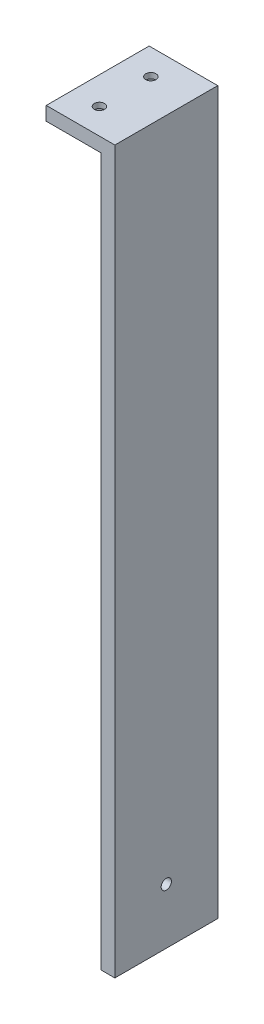
ISO-10303-21;
HEADER;
FILE_DESCRIPTION(('STEP AP214'),'2;1');
FILE_NAME('part.step','',(''),(''),'','','');
FILE_SCHEMA(('AUTOMOTIVE_DESIGN { 1 0 10303 214 1 1 1 1 }'));
ENDSEC;
DATA;
#1=APPLICATION_CONTEXT('core data for automotive mechanical design processes');
#2=APPLICATION_PROTOCOL_DEFINITION('international standard','automotive_design',2000,#1);
#3=PRODUCT_CONTEXT('',#1,'mechanical');
#4=PRODUCT('Part','Part','',(#3));
#5=PRODUCT_RELATED_PRODUCT_CATEGORY('part','',(#4));
#6=PRODUCT_DEFINITION_FORMATION('','',#4);
#7=PRODUCT_DEFINITION_CONTEXT('part definition',#1,'design');
#8=PRODUCT_DEFINITION('design','',#6,#7);
#9=PRODUCT_DEFINITION_SHAPE('','',#8);
#10=(LENGTH_UNIT() NAMED_UNIT(*) SI_UNIT(.MILLI.,.METRE.));
#11=(NAMED_UNIT(*) PLANE_ANGLE_UNIT() SI_UNIT($,.RADIAN.));
#12=(NAMED_UNIT(*) SI_UNIT($,.STERADIAN.) SOLID_ANGLE_UNIT());
#13=UNCERTAINTY_MEASURE_WITH_UNIT(LENGTH_MEASURE(1.E-05),#10,'distance_accuracy_value','');
#14=(GEOMETRIC_REPRESENTATION_CONTEXT(3) GLOBAL_UNCERTAINTY_ASSIGNED_CONTEXT((#13)) GLOBAL_UNIT_ASSIGNED_CONTEXT((#10,
#11,#12)) REPRESENTATION_CONTEXT('',''));
#15=CARTESIAN_POINT('',(0.,0.,0.));
#16=DIRECTION('',(0.,0.,1.));
#17=DIRECTION('',(1.,0.,0.));
#18=AXIS2_PLACEMENT_3D('',#15,#16,#17);
#19=CARTESIAN_POINT('',(111.125,44.0887363974088,-306.40520385916));
#20=DIRECTION('',(-1.,0.,0.));
#21=DIRECTION('',(0.,-1.,0.));
#22=AXIS2_PLACEMENT_3D('',#19,#20,#21);
#23=PLANE('',#22);
#24=CARTESIAN_POINT('',(111.125,-202.469224044113,-19.0500000000011));
#25=DIRECTION('',(-1.,0.,0.));
#26=DIRECTION('',(0.,-1.,0.));
#27=AXIS2_PLACEMENT_3D('',#24,#25,#26);
#28=CIRCLE('',#27,1.89864999999995);
#29=CARTESIAN_POINT('',(111.125,-204.367874044113,-19.0500000000011));
#30=VERTEX_POINT('',#29);
#31=EDGE_CURVE('E270',#30,#30,#28,.T.);
#32=ORIENTED_EDGE('',*,*,#31,.F.);
#33=EDGE_LOOP('',(#32));
#34=FACE_BOUND('',#33,.T.);
#35=DIRECTION('',(0.,0.,1.));
#36=VECTOR('',#35,1.);
#37=CARTESIAN_POINT('',(111.125,39.0087363974088,-306.40520385916));
#38=LINE('',#37,#36);
#39=CARTESIAN_POINT('',(111.125,39.0087363974088,-38.1));
#40=VERTEX_POINT('',#39);
#41=CARTESIAN_POINT('',(111.125,39.0087363974088,0.));
#42=VERTEX_POINT('',#41);
#43=EDGE_CURVE('E306',#40,#42,#38,.T.);
#44=ORIENTED_EDGE('',*,*,#43,.F.);
#45=DIRECTION('',(0.,-1.,0.));
#46=VECTOR('',#45,1.);
#47=CARTESIAN_POINT('',(111.125,44.0887363974088,-38.1));
#48=LINE('',#47,#46);
#49=CARTESIAN_POINT('',(111.125,-223.011474044113,-38.1));
#50=VERTEX_POINT('',#49);
#51=EDGE_CURVE('E273',#40,#50,#48,.T.);
#52=ORIENTED_EDGE('',*,*,#51,.T.);
#53=DIRECTION('',(0.,0.,1.));
#54=VECTOR('',#53,1.);
#55=CARTESIAN_POINT('',(111.125,-223.011474044113,-306.40520385916));
#56=LINE('',#55,#54);
#57=CARTESIAN_POINT('',(111.125,-223.011474044113,0.));
#58=VERTEX_POINT('',#57);
#59=EDGE_CURVE('E41',#50,#58,#56,.T.);
#60=ORIENTED_EDGE('',*,*,#59,.T.);
#61=DIRECTION('',(0.,-1.,0.));
#62=VECTOR('',#61,1.);
#63=CARTESIAN_POINT('',(111.125,44.0887363974088,0.));
#64=LINE('',#63,#62);
#65=EDGE_CURVE('E278',#42,#58,#64,.T.);
#66=ORIENTED_EDGE('',*,*,#65,.F.);
#67=EDGE_LOOP('',(#44,#52,#60,#66));
#68=FACE_BOUND('',#67,.T.);
#69=ADVANCED_FACE('F37',(#34,#68),#23,.T.);
#70=CARTESIAN_POINT('',(90.8050000000002,39.0087363974088,-306.40520385916));
#71=DIRECTION('',(0.,-1.,0.));
#72=DIRECTION('',(0.,0.,-1.));
#73=AXIS2_PLACEMENT_3D('',#70,#71,#72);
#74=PLANE('',#73);
#75=DIRECTION('',(-0.866025403784439,0.,0.5));
#76=VECTOR('',#75,1.);
#77=CARTESIAN_POINT('',(105.156,39.0087363974088,-26.1553250218263));
#78=LINE('',#77,#76);
#79=CARTESIAN_POINT('',(105.156,39.0087363974088,-26.1553250218263));
#80=VERTEX_POINT('',#79);
#81=CARTESIAN_POINT('',(100.965,39.0087363974088,-23.7356500436526));
#82=VERTEX_POINT('',#81);
#83=EDGE_CURVE('E54',#80,#82,#78,.T.);
#84=ORIENTED_EDGE('',*,*,#83,.F.);
#85=DIRECTION('',(0.,0.,1.));
#86=VECTOR('',#85,1.);
#87=CARTESIAN_POINT('',(105.156,39.0087363974088,-30.9946749781738));
#88=LINE('',#87,#86);
#89=CARTESIAN_POINT('',(105.156,39.0087363974088,-30.9946749781738));
#90=VERTEX_POINT('',#89);
#91=EDGE_CURVE('E185',#90,#80,#88,.T.);
#92=ORIENTED_EDGE('',*,*,#91,.F.);
#93=DIRECTION('',(0.866025403784438,0.,0.5));
#94=VECTOR('',#93,1.);
#95=CARTESIAN_POINT('',(100.965,39.0087363974088,-33.4143499563475));
#96=LINE('',#95,#94);
#97=CARTESIAN_POINT('',(100.965,39.0087363974088,-33.4143499563475));
#98=VERTEX_POINT('',#97);
#99=EDGE_CURVE('E188',#98,#90,#96,.T.);
#100=ORIENTED_EDGE('',*,*,#99,.F.);
#101=DIRECTION('',(0.866025403784438,0.,-0.500000000000001));
#102=VECTOR('',#101,1.);
#103=CARTESIAN_POINT('',(96.7740000000002,39.0087363974088,-30.9946749781737));
#104=LINE('',#103,#102);
#105=CARTESIAN_POINT('',(96.7740000000002,39.0087363974088,-30.9946749781737));
#106=VERTEX_POINT('',#105);
#107=EDGE_CURVE('E208',#106,#98,#104,.T.);
#108=ORIENTED_EDGE('',*,*,#107,.F.);
#109=DIRECTION('',(0.,0.,-1.));
#110=VECTOR('',#109,1.);
#111=CARTESIAN_POINT('',(96.7740000000002,39.0087363974088,-26.1553250218263));
#112=LINE('',#111,#110);
#113=CARTESIAN_POINT('',(96.7740000000002,39.0087363974088,-26.1553250218263));
#114=VERTEX_POINT('',#113);
#115=EDGE_CURVE('E205',#114,#106,#112,.T.);
#116=ORIENTED_EDGE('',*,*,#115,.F.);
#117=DIRECTION('',(-0.866025403784439,0.,-0.499999999999999));
#118=VECTOR('',#117,1.);
#119=CARTESIAN_POINT('',(100.965,39.0087363974088,-23.7356500436526));
#120=LINE('',#119,#118);
#121=EDGE_CURVE('E202',#82,#114,#120,.T.);
#122=ORIENTED_EDGE('',*,*,#121,.F.);
#123=EDGE_LOOP('',(#84,#92,#100,#108,#116,#122));
#124=FACE_BOUND('',#123,.T.);
#125=DIRECTION('',(-0.866025403784438,0.,0.500000000000001));
#126=VECTOR('',#125,1.);
#127=CARTESIAN_POINT('',(105.156,39.0087363974088,-7.10532502182619));
#128=LINE('',#127,#126);
#129=CARTESIAN_POINT('',(105.156,39.0087363974088,-7.10532502182619));
#130=VERTEX_POINT('',#129);
#131=CARTESIAN_POINT('',(100.965,39.0087363974088,-4.6856500436525));
#132=VERTEX_POINT('',#131);
#133=EDGE_CURVE('E62',#130,#132,#128,.T.);
#134=ORIENTED_EDGE('',*,*,#133,.F.);
#135=DIRECTION('',(0.,0.,1.));
#136=VECTOR('',#135,1.);
#137=CARTESIAN_POINT('',(105.156,39.0087363974088,-11.9446749781737));
#138=LINE('',#137,#136);
#139=CARTESIAN_POINT('',(105.156,39.0087363974088,-11.9446749781737));
#140=VERTEX_POINT('',#139);
#141=EDGE_CURVE('E227',#140,#130,#138,.T.);
#142=ORIENTED_EDGE('',*,*,#141,.F.);
#143=DIRECTION('',(0.866025403784439,0.,0.499999999999999));
#144=VECTOR('',#143,1.);
#145=CARTESIAN_POINT('',(100.965,39.0087363974088,-14.3643499563474));
#146=LINE('',#145,#144);
#147=CARTESIAN_POINT('',(100.965,39.0087363974088,-14.3643499563474));
#148=VERTEX_POINT('',#147);
#149=EDGE_CURVE('E253',#148,#140,#146,.T.);
#150=ORIENTED_EDGE('',*,*,#149,.F.);
#151=DIRECTION('',(0.866025403784439,0.,-0.5));
#152=VECTOR('',#151,1.);
#153=CARTESIAN_POINT('',(96.7740000000002,39.0087363974088,-11.9446749781737));
#154=LINE('',#153,#152);
#155=CARTESIAN_POINT('',(96.7740000000002,39.0087363974088,-11.9446749781737));
#156=VERTEX_POINT('',#155);
#157=EDGE_CURVE('E250',#156,#148,#154,.T.);
#158=ORIENTED_EDGE('',*,*,#157,.F.);
#159=DIRECTION('',(0.,0.,-1.));
#160=VECTOR('',#159,1.);
#161=CARTESIAN_POINT('',(96.7740000000002,39.0087363974088,-7.10532502182628));
#162=LINE('',#161,#160);
#163=CARTESIAN_POINT('',(96.7740000000002,39.0087363974088,-7.10532502182628));
#164=VERTEX_POINT('',#163);
#165=EDGE_CURVE('E247',#164,#156,#162,.T.);
#166=ORIENTED_EDGE('',*,*,#165,.F.);
#167=DIRECTION('',(-0.866025403784431,0.,-0.500000000000013));
#168=VECTOR('',#167,1.);
#169=CARTESIAN_POINT('',(100.965,39.0087363974088,-4.68565004365248));
#170=LINE('',#169,#168);
#171=EDGE_CURVE('E244',#132,#164,#170,.T.);
#172=ORIENTED_EDGE('',*,*,#171,.F.);
#173=EDGE_LOOP('',(#134,#142,#150,#158,#166,#172));
#174=FACE_BOUND('',#173,.T.);
#175=DIRECTION('',(0.,0.,1.));
#176=VECTOR('',#175,1.);
#177=CARTESIAN_POINT('',(90.8050000000002,39.0087363974088,-306.40520385916));
#178=LINE('',#177,#176);
#179=CARTESIAN_POINT('',(90.8050000000002,39.0087363974088,-38.1));
#180=VERTEX_POINT('',#179);
#181=CARTESIAN_POINT('',(90.8050000000002,39.0087363974088,0.));
#182=VERTEX_POINT('',#181);
#183=EDGE_CURVE('E283',#180,#182,#178,.T.);
#184=ORIENTED_EDGE('',*,*,#183,.F.);
#185=DIRECTION('',(1.,0.,0.));
#186=VECTOR('',#185,1.);
#187=CARTESIAN_POINT('',(90.8050000000002,39.0087363974088,-38.1));
#188=LINE('',#187,#186);
#189=EDGE_CURVE('E304',#180,#40,#188,.T.);
#190=ORIENTED_EDGE('',*,*,#189,.T.);
#191=ORIENTED_EDGE('',*,*,#43,.T.);
#192=DIRECTION('',(1.,0.,0.));
#193=VECTOR('',#192,1.);
#194=CARTESIAN_POINT('',(90.8050000000002,39.0087363974088,0.));
#195=LINE('',#194,#193);
#196=EDGE_CURVE('E274',#182,#42,#195,.T.);
#197=ORIENTED_EDGE('',*,*,#196,.F.);
#198=EDGE_LOOP('',(#184,#190,#191,#197));
#199=FACE_BOUND('',#198,.T.);
#200=ADVANCED_FACE('F337',(#124,#174,#199),#74,.T.);
#201=CARTESIAN_POINT('',(90.8050000000002,39.0087363974088,-306.40520385916));
#202=DIRECTION('',(1.,0.,0.));
#203=DIRECTION('',(0.,0.,-1.));
#204=AXIS2_PLACEMENT_3D('',#201,#202,#203);
#205=PLANE('',#204);
#206=DIRECTION('',(0.,1.,0.));
#207=VECTOR('',#206,1.);
#208=CARTESIAN_POINT('',(90.8050000000002,39.0087363974088,-38.1));
#209=LINE('',#208,#207);
#210=CARTESIAN_POINT('',(90.8050000000002,44.0887363974088,-38.1));
#211=VERTEX_POINT('',#210);
#212=EDGE_CURVE('E277',#180,#211,#209,.T.);
#213=ORIENTED_EDGE('',*,*,#212,.F.);
#214=ORIENTED_EDGE('',*,*,#183,.T.);
#215=DIRECTION('',(0.,1.,0.));
#216=VECTOR('',#215,1.);
#217=CARTESIAN_POINT('',(90.8050000000002,39.0087363974088,0.));
#218=LINE('',#217,#216);
#219=CARTESIAN_POINT('',(90.8050000000002,44.0887363974088,0.));
#220=VERTEX_POINT('',#219);
#221=EDGE_CURVE('E279',#182,#220,#218,.T.);
#222=ORIENTED_EDGE('',*,*,#221,.T.);
#223=DIRECTION('',(0.,0.,1.));
#224=VECTOR('',#223,1.);
#225=CARTESIAN_POINT('',(90.8050000000002,44.0887363974088,-306.40520385916));
#226=LINE('',#225,#224);
#227=EDGE_CURVE('E282',#211,#220,#226,.T.);
#228=ORIENTED_EDGE('',*,*,#227,.F.);
#229=EDGE_LOOP('',(#213,#214,#222,#228));
#230=FACE_BOUND('',#229,.T.);
#231=ADVANCED_FACE('F338',(#230),#205,.F.);
#232=CARTESIAN_POINT('',(90.8050000000002,44.0887363974088,-306.40520385916));
#233=DIRECTION('',(0.,-1.,0.));
#234=DIRECTION('',(0.,0.,-1.));
#235=AXIS2_PLACEMENT_3D('',#232,#233,#234);
#236=PLANE('',#235);
#237=CARTESIAN_POINT('',(100.965,44.0887363974088,-28.575));
#238=DIRECTION('',(0.,-1.,0.));
#239=DIRECTION('',(0.,0.,-1.));
#240=AXIS2_PLACEMENT_3D('',#237,#238,#239);
#241=CIRCLE('',#240,1.89865);
#242=CARTESIAN_POINT('',(100.965,44.0887363974088,-30.47365));
#243=VERTEX_POINT('',#242);
#244=EDGE_CURVE('E432',#243,#243,#241,.T.);
#245=ORIENTED_EDGE('',*,*,#244,.T.);
#246=EDGE_LOOP('',(#245));
#247=FACE_BOUND('',#246,.T.);
#248=CARTESIAN_POINT('',(100.965,44.0887363974088,-9.525));
#249=DIRECTION('',(0.,-1.,0.));
#250=DIRECTION('',(0.,0.,-1.));
#251=AXIS2_PLACEMENT_3D('',#248,#249,#250);
#252=CIRCLE('',#251,1.89865);
#253=CARTESIAN_POINT('',(100.965,44.0887363974088,-11.42365));
#254=VERTEX_POINT('',#253);
#255=EDGE_CURVE('E191',#254,#254,#252,.T.);
#256=ORIENTED_EDGE('',*,*,#255,.T.);
#257=EDGE_LOOP('',(#256));
#258=FACE_BOUND('',#257,.T.);
#259=DIRECTION('',(1.,0.,0.));
#260=VECTOR('',#259,1.);
#261=CARTESIAN_POINT('',(90.8050000000002,44.0887363974088,-38.1));
#262=LINE('',#261,#260);
#263=CARTESIAN_POINT('',(116.205,44.0887363974088,-38.1));
#264=VERTEX_POINT('',#263);
#265=EDGE_CURVE('E299',#211,#264,#262,.T.);
#266=ORIENTED_EDGE('',*,*,#265,.F.);
#267=ORIENTED_EDGE('',*,*,#227,.T.);
#268=DIRECTION('',(1.,0.,0.));
#269=VECTOR('',#268,1.);
#270=CARTESIAN_POINT('',(90.8050000000002,44.0887363974088,0.));
#271=LINE('',#270,#269);
#272=CARTESIAN_POINT('',(116.205,44.0887363974088,0.));
#273=VERTEX_POINT('',#272);
#274=EDGE_CURVE('E284',#220,#273,#271,.T.);
#275=ORIENTED_EDGE('',*,*,#274,.T.);
#276=DIRECTION('',(0.,0.,1.));
#277=VECTOR('',#276,1.);
#278=CARTESIAN_POINT('',(116.205,44.0887363974088,-306.40520385916));
#279=LINE('',#278,#277);
#280=EDGE_CURVE('E287',#264,#273,#279,.T.);
#281=ORIENTED_EDGE('',*,*,#280,.F.);
#282=EDGE_LOOP('',(#266,#267,#275,#281));
#283=FACE_BOUND('',#282,.T.);
#284=ADVANCED_FACE('F332',(#247,#258,#283),#236,.F.);
#285=CARTESIAN_POINT('',(116.205,44.0887363974088,-306.40520385916));
#286=DIRECTION('',(-1.,0.,0.));
#287=DIRECTION('',(0.,-1.,0.));
#288=AXIS2_PLACEMENT_3D('',#285,#286,#287);
#289=PLANE('',#288);
#290=CARTESIAN_POINT('',(116.205,-202.469224044113,-19.0500000000011));
#291=DIRECTION('',(1.,0.,0.));
#292=DIRECTION('',(0.,1.,0.));
#293=AXIS2_PLACEMENT_3D('',#290,#291,#292);
#294=CIRCLE('',#293,1.89864999999995);
#295=CARTESIAN_POINT('',(116.205,-200.570574044113,-19.0500000000011));
#296=VERTEX_POINT('',#295);
#297=EDGE_CURVE('E215',#296,#296,#294,.T.);
#298=ORIENTED_EDGE('',*,*,#297,.F.);
#299=EDGE_LOOP('',(#298));
#300=FACE_BOUND('',#299,.T.);
#301=DIRECTION('',(0.,-1.,0.));
#302=VECTOR('',#301,1.);
#303=CARTESIAN_POINT('',(116.205,44.0887363974088,-38.1));
#304=LINE('',#303,#302);
#305=CARTESIAN_POINT('',(116.205,-223.011474044113,-38.1));
#306=VERTEX_POINT('',#305);
#307=EDGE_CURVE('E46',#264,#306,#304,.T.);
#308=ORIENTED_EDGE('',*,*,#307,.F.);
#309=ORIENTED_EDGE('',*,*,#280,.T.);
#310=DIRECTION('',(0.,-1.,0.));
#311=VECTOR('',#310,1.);
#312=CARTESIAN_POINT('',(116.205,44.0887363974088,0.));
#313=LINE('',#312,#311);
#314=CARTESIAN_POINT('',(116.205,-223.011474044113,0.));
#315=VERTEX_POINT('',#314);
#316=EDGE_CURVE('E288',#273,#315,#313,.T.);
#317=ORIENTED_EDGE('',*,*,#316,.T.);
#318=DIRECTION('',(0.,0.,1.));
#319=VECTOR('',#318,1.);
#320=CARTESIAN_POINT('',(116.205,-223.011474044113,-306.40520385916));
#321=LINE('',#320,#319);
#322=EDGE_CURVE('E291',#306,#315,#321,.T.);
#323=ORIENTED_EDGE('',*,*,#322,.F.);
#324=EDGE_LOOP('',(#308,#309,#317,#323));
#325=FACE_BOUND('',#324,.T.);
#326=ADVANCED_FACE('F318',(#300,#325),#289,.F.);
#327=CARTESIAN_POINT('',(116.205,-223.011474044113,-306.40520385916));
#328=DIRECTION('',(0.,1.,0.));
#329=DIRECTION('',(-1.,0.,0.));
#330=AXIS2_PLACEMENT_3D('',#327,#328,#329);
#331=PLANE('',#330);
#332=DIRECTION('',(-1.,0.,0.));
#333=VECTOR('',#332,1.);
#334=CARTESIAN_POINT('',(116.205,-223.011474044113,-38.1));
#335=LINE('',#334,#333);
#336=EDGE_CURVE('E11',#306,#50,#335,.T.);
#337=ORIENTED_EDGE('',*,*,#336,.F.);
#338=ORIENTED_EDGE('',*,*,#322,.T.);
#339=DIRECTION('',(-1.,0.,0.));
#340=VECTOR('',#339,1.);
#341=CARTESIAN_POINT('',(116.205,-223.011474044113,0.));
#342=LINE('',#341,#340);
#343=EDGE_CURVE('E292',#315,#58,#342,.T.);
#344=ORIENTED_EDGE('',*,*,#343,.T.);
#345=ORIENTED_EDGE('',*,*,#59,.F.);
#346=EDGE_LOOP('',(#337,#338,#344,#345));
#347=FACE_BOUND('',#346,.T.);
#348=ADVANCED_FACE('F314',(#347),#331,.F.);
#349=CARTESIAN_POINT('',(0.,0.,0.));
#350=DIRECTION('',(0.,0.,-1.));
#351=DIRECTION('',(-1.,0.,0.));
#352=AXIS2_PLACEMENT_3D('',#349,#350,#351);
#353=PLANE('',#352);
#354=ORIENTED_EDGE('',*,*,#65,.T.);
#355=ORIENTED_EDGE('',*,*,#343,.F.);
#356=ORIENTED_EDGE('',*,*,#316,.F.);
#357=ORIENTED_EDGE('',*,*,#274,.F.);
#358=ORIENTED_EDGE('',*,*,#221,.F.);
#359=ORIENTED_EDGE('',*,*,#196,.T.);
#360=EDGE_LOOP('',(#354,#355,#356,#357,#358,#359));
#361=FACE_BOUND('',#360,.T.);
#362=ADVANCED_FACE('F322',(#361),#353,.F.);
#363=CARTESIAN_POINT('',(0.,0.,-38.1));
#364=DIRECTION('',(0.,0.,-1.));
#365=DIRECTION('',(-1.,0.,0.));
#366=AXIS2_PLACEMENT_3D('',#363,#364,#365);
#367=PLANE('',#366);
#368=ORIENTED_EDGE('',*,*,#51,.F.);
#369=ORIENTED_EDGE('',*,*,#189,.F.);
#370=ORIENTED_EDGE('',*,*,#212,.T.);
#371=ORIENTED_EDGE('',*,*,#265,.T.);
#372=ORIENTED_EDGE('',*,*,#307,.T.);
#373=ORIENTED_EDGE('',*,*,#336,.T.);
#374=EDGE_LOOP('',(#368,#369,#370,#371,#372,#373));
#375=FACE_BOUND('',#374,.T.);
#376=ADVANCED_FACE('F39',(#375),#367,.T.);
#377=CARTESIAN_POINT('',(90.8050000000002,-202.469224044113,-19.0500000000011));
#378=DIRECTION('',(1.,0.,0.));
#379=DIRECTION('',(0.,1.,0.));
#380=AXIS2_PLACEMENT_3D('',#377,#378,#379);
#381=CYLINDRICAL_SURFACE('',#380,1.89864999999995);
#382=ORIENTED_EDGE('',*,*,#31,.T.);
#383=EDGE_LOOP('',(#382));
#384=FACE_BOUND('',#383,.T.);
#385=ORIENTED_EDGE('',*,*,#297,.T.);
#386=EDGE_LOOP('',(#385));
#387=FACE_BOUND('',#386,.T.);
#388=ADVANCED_FACE('F355',(#384,#387),#381,.F.);
#389=CARTESIAN_POINT('',(105.156,42.0567363974088,-7.10532502182619));
#390=DIRECTION('',(0.500000000000001,0.,0.866025403784438));
#391=DIRECTION('',(0.866025403784438,0.,-0.500000000000001));
#392=AXIS2_PLACEMENT_3D('',#389,#390,#391);
#393=PLANE('',#392);
#394=ORIENTED_EDGE('',*,*,#133,.T.);
#395=DIRECTION('',(0.,-1.,0.));
#396=VECTOR('',#395,1.);
#397=CARTESIAN_POINT('',(100.965,42.0567363974088,-4.68565004365248));
#398=LINE('',#397,#396);
#399=CARTESIAN_POINT('',(100.965,42.0567363974088,-4.68565004365248));
#400=VERTEX_POINT('',#399);
#401=EDGE_CURVE('E242',#400,#132,#398,.T.);
#402=ORIENTED_EDGE('',*,*,#401,.F.);
#403=DIRECTION('',(-0.866025403784438,0.,0.500000000000001));
#404=VECTOR('',#403,1.);
#405=CARTESIAN_POINT('',(105.156,42.0567363974088,-7.10532502182619));
#406=LINE('',#405,#404);
#407=CARTESIAN_POINT('',(105.156,42.0567363974088,-7.10532502182619));
#408=VERTEX_POINT('',#407);
#409=EDGE_CURVE('E223',#408,#400,#406,.T.);
#410=ORIENTED_EDGE('',*,*,#409,.F.);
#411=DIRECTION('',(0.,-1.,0.));
#412=VECTOR('',#411,1.);
#413=CARTESIAN_POINT('',(105.156,42.0567363974088,-7.10532502182619));
#414=LINE('',#413,#412);
#415=EDGE_CURVE('E203',#408,#130,#414,.T.);
#416=ORIENTED_EDGE('',*,*,#415,.T.);
#417=EDGE_LOOP('',(#394,#402,#410,#416));
#418=FACE_BOUND('',#417,.T.);
#419=ADVANCED_FACE('F358',(#418),#393,.F.);
#420=CARTESIAN_POINT('',(105.156,42.0567363974088,-11.9446749781737));
#421=DIRECTION('',(1.,0.,0.));
#422=DIRECTION('',(0.,0.,-1.));
#423=AXIS2_PLACEMENT_3D('',#420,#421,#422);
#424=PLANE('',#423);
#425=ORIENTED_EDGE('',*,*,#141,.T.);
#426=ORIENTED_EDGE('',*,*,#415,.F.);
#427=DIRECTION('',(0.,0.,1.));
#428=VECTOR('',#427,1.);
#429=CARTESIAN_POINT('',(105.156,42.0567363974088,-11.9446749781737));
#430=LINE('',#429,#428);
#431=CARTESIAN_POINT('',(105.156,42.0567363974088,-11.9446749781737));
#432=VERTEX_POINT('',#431);
#433=EDGE_CURVE('E239',#432,#408,#430,.T.);
#434=ORIENTED_EDGE('',*,*,#433,.F.);
#435=DIRECTION('',(0.,-1.,0.));
#436=VECTOR('',#435,1.);
#437=CARTESIAN_POINT('',(105.156,42.0567363974088,-11.9446749781737));
#438=LINE('',#437,#436);
#439=EDGE_CURVE('E259',#432,#140,#438,.T.);
#440=ORIENTED_EDGE('',*,*,#439,.T.);
#441=EDGE_LOOP('',(#425,#426,#434,#440));
#442=FACE_BOUND('',#441,.T.);
#443=ADVANCED_FACE('F373',(#442),#424,.F.);
#444=CARTESIAN_POINT('',(100.965,42.0567363974088,-14.3643499563474));
#445=DIRECTION('',(0.499999999999999,0.,-0.866025403784439));
#446=DIRECTION('',(-0.866025403784439,0.,-0.499999999999999));
#447=AXIS2_PLACEMENT_3D('',#444,#445,#446);
#448=PLANE('',#447);
#449=ORIENTED_EDGE('',*,*,#149,.T.);
#450=ORIENTED_EDGE('',*,*,#439,.F.);
#451=DIRECTION('',(0.866025403784439,0.,0.499999999999999));
#452=VECTOR('',#451,1.);
#453=CARTESIAN_POINT('',(100.965,42.0567363974088,-14.3643499563474));
#454=LINE('',#453,#452);
#455=CARTESIAN_POINT('',(100.965,42.0567363974088,-14.3643499563474));
#456=VERTEX_POINT('',#455);
#457=EDGE_CURVE('E236',#456,#432,#454,.T.);
#458=ORIENTED_EDGE('',*,*,#457,.F.);
#459=DIRECTION('',(0.,-1.,0.));
#460=VECTOR('',#459,1.);
#461=CARTESIAN_POINT('',(100.965,42.0567363974088,-14.3643499563474));
#462=LINE('',#461,#460);
#463=EDGE_CURVE('E261',#456,#148,#462,.T.);
#464=ORIENTED_EDGE('',*,*,#463,.T.);
#465=EDGE_LOOP('',(#449,#450,#458,#464));
#466=FACE_BOUND('',#465,.T.);
#467=ADVANCED_FACE('F386',(#466),#448,.F.);
#468=CARTESIAN_POINT('',(96.7740000000002,42.0567363974088,-11.9446749781737));
#469=DIRECTION('',(-0.5,0.,-0.866025403784439));
#470=DIRECTION('',(-0.866025403784439,0.,0.5));
#471=AXIS2_PLACEMENT_3D('',#468,#469,#470);
#472=PLANE('',#471);
#473=ORIENTED_EDGE('',*,*,#157,.T.);
#474=ORIENTED_EDGE('',*,*,#463,.F.);
#475=DIRECTION('',(0.866025403784439,0.,-0.5));
#476=VECTOR('',#475,1.);
#477=CARTESIAN_POINT('',(96.7740000000002,42.0567363974088,-11.9446749781737));
#478=LINE('',#477,#476);
#479=CARTESIAN_POINT('',(96.7740000000002,42.0567363974088,-11.9446749781737));
#480=VERTEX_POINT('',#479);
#481=EDGE_CURVE('E233',#480,#456,#478,.T.);
#482=ORIENTED_EDGE('',*,*,#481,.F.);
#483=DIRECTION('',(0.,-1.,0.));
#484=VECTOR('',#483,1.);
#485=CARTESIAN_POINT('',(96.7740000000002,42.0567363974088,-11.9446749781737));
#486=LINE('',#485,#484);
#487=EDGE_CURVE('E263',#480,#156,#486,.T.);
#488=ORIENTED_EDGE('',*,*,#487,.T.);
#489=EDGE_LOOP('',(#473,#474,#482,#488));
#490=FACE_BOUND('',#489,.T.);
#491=ADVANCED_FACE('F382',(#490),#472,.F.);
#492=CARTESIAN_POINT('',(96.7740000000002,42.0567363974088,-7.10532502182628));
#493=DIRECTION('',(-1.,0.,0.));
#494=DIRECTION('',(0.,0.,1.));
#495=AXIS2_PLACEMENT_3D('',#492,#493,#494);
#496=PLANE('',#495);
#497=ORIENTED_EDGE('',*,*,#165,.T.);
#498=ORIENTED_EDGE('',*,*,#487,.F.);
#499=DIRECTION('',(0.,0.,-1.));
#500=VECTOR('',#499,1.);
#501=CARTESIAN_POINT('',(96.7740000000002,42.0567363974088,-7.10532502182628));
#502=LINE('',#501,#500);
#503=CARTESIAN_POINT('',(96.7740000000002,42.0567363974088,-7.10532502182628));
#504=VERTEX_POINT('',#503);
#505=EDGE_CURVE('E230',#504,#480,#502,.T.);
#506=ORIENTED_EDGE('',*,*,#505,.F.);
#507=DIRECTION('',(0.,-1.,0.));
#508=VECTOR('',#507,1.);
#509=CARTESIAN_POINT('',(96.7740000000002,42.0567363974088,-7.10532502182628));
#510=LINE('',#509,#508);
#511=EDGE_CURVE('E265',#504,#164,#510,.T.);
#512=ORIENTED_EDGE('',*,*,#511,.T.);
#513=EDGE_LOOP('',(#497,#498,#506,#512));
#514=FACE_BOUND('',#513,.T.);
#515=ADVANCED_FACE('F378',(#514),#496,.F.);
#516=CARTESIAN_POINT('',(100.965,42.0567363974088,-4.68565004365248));
#517=DIRECTION('',(-0.500000000000013,0.,0.866025403784431));
#518=DIRECTION('',(0.866025403784431,0.,0.500000000000013));
#519=AXIS2_PLACEMENT_3D('',#516,#517,#518);
#520=PLANE('',#519);
#521=ORIENTED_EDGE('',*,*,#171,.T.);
#522=ORIENTED_EDGE('',*,*,#511,.F.);
#523=DIRECTION('',(-0.866025403784431,0.,-0.500000000000013));
#524=VECTOR('',#523,1.);
#525=CARTESIAN_POINT('',(100.965,42.0567363974088,-4.68565004365248));
#526=LINE('',#525,#524);
#527=EDGE_CURVE('E226',#400,#504,#526,.T.);
#528=ORIENTED_EDGE('',*,*,#527,.F.);
#529=ORIENTED_EDGE('',*,*,#401,.T.);
#530=EDGE_LOOP('',(#521,#522,#528,#529));
#531=FACE_BOUND('',#530,.T.);
#532=ADVANCED_FACE('F374',(#531),#520,.F.);
#533=CARTESIAN_POINT('',(0.,42.0567363974088,0.));
#534=DIRECTION('',(0.,-1.,0.));
#535=DIRECTION('',(0.,0.,-1.));
#536=AXIS2_PLACEMENT_3D('',#533,#534,#535);
#537=PLANE('',#536);
#538=CARTESIAN_POINT('',(100.965,42.0567363974088,-9.525));
#539=DIRECTION('',(0.,-1.,0.));
#540=DIRECTION('',(0.,0.,-1.));
#541=AXIS2_PLACEMENT_3D('',#538,#539,#540);
#542=CIRCLE('',#541,1.89864999999999);
#543=CARTESIAN_POINT('',(100.965,42.0567363974088,-11.42365));
#544=VERTEX_POINT('',#543);
#545=EDGE_CURVE('E437',#544,#544,#542,.T.);
#546=ORIENTED_EDGE('',*,*,#545,.F.);
#547=EDGE_LOOP('',(#546));
#548=FACE_BOUND('',#547,.T.);
#549=ORIENTED_EDGE('',*,*,#409,.T.);
#550=ORIENTED_EDGE('',*,*,#527,.T.);
#551=ORIENTED_EDGE('',*,*,#505,.T.);
#552=ORIENTED_EDGE('',*,*,#481,.T.);
#553=ORIENTED_EDGE('',*,*,#457,.T.);
#554=ORIENTED_EDGE('',*,*,#433,.T.);
#555=EDGE_LOOP('',(#549,#550,#551,#552,#553,#554));
#556=FACE_BOUND('',#555,.T.);
#557=ADVANCED_FACE('F377',(#548,#556),#537,.T.);
#558=CARTESIAN_POINT('',(105.156,42.0567363974088,-26.1553250218263));
#559=DIRECTION('',(0.499999999999999,0.,0.866025403784439));
#560=DIRECTION('',(0.866025403784439,0.,-0.499999999999999));
#561=AXIS2_PLACEMENT_3D('',#558,#559,#560);
#562=PLANE('',#561);
#563=ORIENTED_EDGE('',*,*,#83,.T.);
#564=DIRECTION('',(0.,-1.,0.));
#565=VECTOR('',#564,1.);
#566=CARTESIAN_POINT('',(100.965,42.0567363974088,-23.7356500436526));
#567=LINE('',#566,#565);
#568=CARTESIAN_POINT('',(100.965,42.0567363974088,-23.7356500436526));
#569=VERTEX_POINT('',#568);
#570=EDGE_CURVE('E162',#569,#82,#567,.T.);
#571=ORIENTED_EDGE('',*,*,#570,.F.);
#572=DIRECTION('',(-0.866025403784439,0.,0.5));
#573=VECTOR('',#572,1.);
#574=CARTESIAN_POINT('',(105.156,42.0567363974088,-26.1553250218263));
#575=LINE('',#574,#573);
#576=CARTESIAN_POINT('',(105.156,42.0567363974088,-26.1553250218263));
#577=VERTEX_POINT('',#576);
#578=EDGE_CURVE('E166',#577,#569,#575,.T.);
#579=ORIENTED_EDGE('',*,*,#578,.F.);
#580=DIRECTION('',(0.,-1.,0.));
#581=VECTOR('',#580,1.);
#582=CARTESIAN_POINT('',(105.156,42.0567363974088,-26.1553250218263));
#583=LINE('',#582,#581);
#584=EDGE_CURVE('E213',#577,#80,#583,.T.);
#585=ORIENTED_EDGE('',*,*,#584,.T.);
#586=EDGE_LOOP('',(#563,#571,#579,#585));
#587=FACE_BOUND('',#586,.T.);
#588=ADVANCED_FACE('F164',(#587),#562,.F.);
#589=CARTESIAN_POINT('',(105.156,42.0567363974088,-30.9946749781738));
#590=DIRECTION('',(1.,0.,0.));
#591=DIRECTION('',(0.,0.,-1.));
#592=AXIS2_PLACEMENT_3D('',#589,#590,#591);
#593=PLANE('',#592);
#594=ORIENTED_EDGE('',*,*,#91,.T.);
#595=ORIENTED_EDGE('',*,*,#584,.F.);
#596=DIRECTION('',(0.,0.,1.));
#597=VECTOR('',#596,1.);
#598=CARTESIAN_POINT('',(105.156,42.0567363974088,-30.9946749781738));
#599=LINE('',#598,#597);
#600=CARTESIAN_POINT('',(105.156,42.0567363974088,-30.9946749781738));
#601=VERTEX_POINT('',#600);
#602=EDGE_CURVE('E172',#601,#577,#599,.T.);
#603=ORIENTED_EDGE('',*,*,#602,.F.);
#604=DIRECTION('',(0.,-1.,0.));
#605=VECTOR('',#604,1.);
#606=CARTESIAN_POINT('',(105.156,42.0567363974088,-30.9946749781738));
#607=LINE('',#606,#605);
#608=EDGE_CURVE('E216',#601,#90,#607,.T.);
#609=ORIENTED_EDGE('',*,*,#608,.T.);
#610=EDGE_LOOP('',(#594,#595,#603,#609));
#611=FACE_BOUND('',#610,.T.);
#612=ADVANCED_FACE('F399',(#611),#593,.F.);
#613=CARTESIAN_POINT('',(100.965,42.0567363974088,-33.4143499563475));
#614=DIRECTION('',(0.5,0.,-0.866025403784439));
#615=DIRECTION('',(-0.866025403784439,0.,-0.5));
#616=AXIS2_PLACEMENT_3D('',#613,#614,#615);
#617=PLANE('',#616);
#618=ORIENTED_EDGE('',*,*,#99,.T.);
#619=ORIENTED_EDGE('',*,*,#608,.F.);
#620=DIRECTION('',(0.866025403784438,0.,0.5));
#621=VECTOR('',#620,1.);
#622=CARTESIAN_POINT('',(100.965,42.0567363974088,-33.4143499563475));
#623=LINE('',#622,#621);
#624=CARTESIAN_POINT('',(100.965,42.0567363974088,-33.4143499563475));
#625=VERTEX_POINT('',#624);
#626=EDGE_CURVE('E198',#625,#601,#623,.T.);
#627=ORIENTED_EDGE('',*,*,#626,.F.);
#628=DIRECTION('',(0.,-1.,0.));
#629=VECTOR('',#628,1.);
#630=CARTESIAN_POINT('',(100.965,42.0567363974088,-33.4143499563475));
#631=LINE('',#630,#629);
#632=EDGE_CURVE('E218',#625,#98,#631,.T.);
#633=ORIENTED_EDGE('',*,*,#632,.T.);
#634=EDGE_LOOP('',(#618,#619,#627,#633));
#635=FACE_BOUND('',#634,.T.);
#636=ADVANCED_FACE('F409',(#635),#617,.F.);
#637=CARTESIAN_POINT('',(96.7740000000002,42.0567363974088,-30.9946749781737));
#638=DIRECTION('',(-0.500000000000001,0.,-0.866025403784438));
#639=DIRECTION('',(-0.866025403784438,0.,0.500000000000001));
#640=AXIS2_PLACEMENT_3D('',#637,#638,#639);
#641=PLANE('',#640);
#642=ORIENTED_EDGE('',*,*,#107,.T.);
#643=ORIENTED_EDGE('',*,*,#632,.F.);
#644=DIRECTION('',(0.866025403784438,0.,-0.500000000000001));
#645=VECTOR('',#644,1.);
#646=CARTESIAN_POINT('',(96.7740000000002,42.0567363974088,-30.9946749781737));
#647=LINE('',#646,#645);
#648=CARTESIAN_POINT('',(96.7740000000002,42.0567363974088,-30.9946749781737));
#649=VERTEX_POINT('',#648);
#650=EDGE_CURVE('E195',#649,#625,#647,.T.);
#651=ORIENTED_EDGE('',*,*,#650,.F.);
#652=DIRECTION('',(0.,-1.,0.));
#653=VECTOR('',#652,1.);
#654=CARTESIAN_POINT('',(96.7740000000002,42.0567363974088,-30.9946749781737));
#655=LINE('',#654,#653);
#656=EDGE_CURVE('E220',#649,#106,#655,.T.);
#657=ORIENTED_EDGE('',*,*,#656,.T.);
#658=EDGE_LOOP('',(#642,#643,#651,#657));
#659=FACE_BOUND('',#658,.T.);
#660=ADVANCED_FACE('F405',(#659),#641,.F.);
#661=CARTESIAN_POINT('',(96.7740000000002,42.0567363974088,-26.1553250218263));
#662=DIRECTION('',(-1.,0.,0.));
#663=DIRECTION('',(0.,0.,1.));
#664=AXIS2_PLACEMENT_3D('',#661,#662,#663);
#665=PLANE('',#664);
#666=ORIENTED_EDGE('',*,*,#115,.T.);
#667=ORIENTED_EDGE('',*,*,#656,.F.);
#668=DIRECTION('',(0.,0.,-1.));
#669=VECTOR('',#668,1.);
#670=CARTESIAN_POINT('',(96.7740000000002,42.0567363974088,-26.1553250218263));
#671=LINE('',#670,#669);
#672=CARTESIAN_POINT('',(96.7740000000002,42.0567363974088,-26.1553250218263));
#673=VERTEX_POINT('',#672);
#674=EDGE_CURVE('E180',#673,#649,#671,.T.);
#675=ORIENTED_EDGE('',*,*,#674,.F.);
#676=DIRECTION('',(0.,-1.,0.));
#677=VECTOR('',#676,1.);
#678=CARTESIAN_POINT('',(96.7740000000002,42.0567363974088,-26.1553250218263));
#679=LINE('',#678,#677);
#680=EDGE_CURVE('E171',#673,#114,#679,.T.);
#681=ORIENTED_EDGE('',*,*,#680,.T.);
#682=EDGE_LOOP('',(#666,#667,#675,#681));
#683=FACE_BOUND('',#682,.T.);
#684=ADVANCED_FACE('F402',(#683),#665,.F.);
#685=CARTESIAN_POINT('',(100.965,42.0567363974088,-23.7356500436526));
#686=DIRECTION('',(-0.499999999999999,0.,0.866025403784439));
#687=DIRECTION('',(0.866025403784439,0.,0.499999999999999));
#688=AXIS2_PLACEMENT_3D('',#685,#686,#687);
#689=PLANE('',#688);
#690=ORIENTED_EDGE('',*,*,#121,.T.);
#691=ORIENTED_EDGE('',*,*,#680,.F.);
#692=DIRECTION('',(-0.866025403784439,0.,-0.499999999999999));
#693=VECTOR('',#692,1.);
#694=CARTESIAN_POINT('',(100.965,42.0567363974088,-23.7356500436526));
#695=LINE('',#694,#693);
#696=EDGE_CURVE('E175',#569,#673,#695,.T.);
#697=ORIENTED_EDGE('',*,*,#696,.F.);
#698=ORIENTED_EDGE('',*,*,#570,.T.);
#699=EDGE_LOOP('',(#690,#691,#697,#698));
#700=FACE_BOUND('',#699,.T.);
#701=ADVANCED_FACE('F176',(#700),#689,.F.);
#702=CARTESIAN_POINT('',(0.,42.0567363974088,0.));
#703=DIRECTION('',(0.,-1.,0.));
#704=DIRECTION('',(0.,0.,-1.));
#705=AXIS2_PLACEMENT_3D('',#702,#703,#704);
#706=PLANE('',#705);
#707=CARTESIAN_POINT('',(100.965,42.0567363974088,-28.575));
#708=DIRECTION('',(0.,-1.,0.));
#709=DIRECTION('',(0.,0.,-1.));
#710=AXIS2_PLACEMENT_3D('',#707,#708,#709);
#711=CIRCLE('',#710,1.89864999999999);
#712=CARTESIAN_POINT('',(100.965,42.0567363974088,-30.47365));
#713=VERTEX_POINT('',#712);
#714=EDGE_CURVE('E435',#713,#713,#711,.T.);
#715=ORIENTED_EDGE('',*,*,#714,.F.);
#716=EDGE_LOOP('',(#715));
#717=FACE_BOUND('',#716,.T.);
#718=ORIENTED_EDGE('',*,*,#578,.T.);
#719=ORIENTED_EDGE('',*,*,#696,.T.);
#720=ORIENTED_EDGE('',*,*,#674,.T.);
#721=ORIENTED_EDGE('',*,*,#650,.T.);
#722=ORIENTED_EDGE('',*,*,#626,.T.);
#723=ORIENTED_EDGE('',*,*,#602,.T.);
#724=EDGE_LOOP('',(#718,#719,#720,#721,#722,#723));
#725=FACE_BOUND('',#724,.T.);
#726=ADVANCED_FACE('F182',(#717,#725),#706,.T.);
#727=CARTESIAN_POINT('',(100.965,42.0567363974088,-9.525));
#728=DIRECTION('',(0.,-1.,0.));
#729=DIRECTION('',(0.,0.,-1.));
#730=AXIS2_PLACEMENT_3D('',#727,#728,#729);
#731=CYLINDRICAL_SURFACE('',#730,1.89864999999999);
#732=ORIENTED_EDGE('',*,*,#255,.F.);
#733=EDGE_LOOP('',(#732));
#734=FACE_BOUND('',#733,.T.);
#735=ORIENTED_EDGE('',*,*,#545,.T.);
#736=EDGE_LOOP('',(#735));
#737=FACE_BOUND('',#736,.T.);
#738=ADVANCED_FACE('F419',(#734,#737),#731,.F.);
#739=CARTESIAN_POINT('',(100.965,42.0567363974088,-28.575));
#740=DIRECTION('',(0.,-1.,0.));
#741=DIRECTION('',(0.,0.,-1.));
#742=AXIS2_PLACEMENT_3D('',#739,#740,#741);
#743=CYLINDRICAL_SURFACE('',#742,1.89864999999999);
#744=ORIENTED_EDGE('',*,*,#244,.F.);
#745=EDGE_LOOP('',(#744));
#746=FACE_BOUND('',#745,.T.);
#747=ORIENTED_EDGE('',*,*,#714,.T.);
#748=EDGE_LOOP('',(#747));
#749=FACE_BOUND('',#748,.T.);
#750=ADVANCED_FACE('F423',(#746,#749),#743,.F.);
#751=CLOSED_SHELL('',(#69,#200,#231,#284,#326,#348,#362,#376,#388,#419,#443,#467,#491,#515,#532,
#557,#588,#612,#636,#660,#684,#701,#726,#738,#750));
#752=MANIFOLD_SOLID_BREP('B2',#751);
#753=ADVANCED_BREP_SHAPE_REPRESENTATION('',(#18,#752),#14);
#754=SHAPE_DEFINITION_REPRESENTATION(#9,#753);
ENDSEC;
END-ISO-10303-21;
